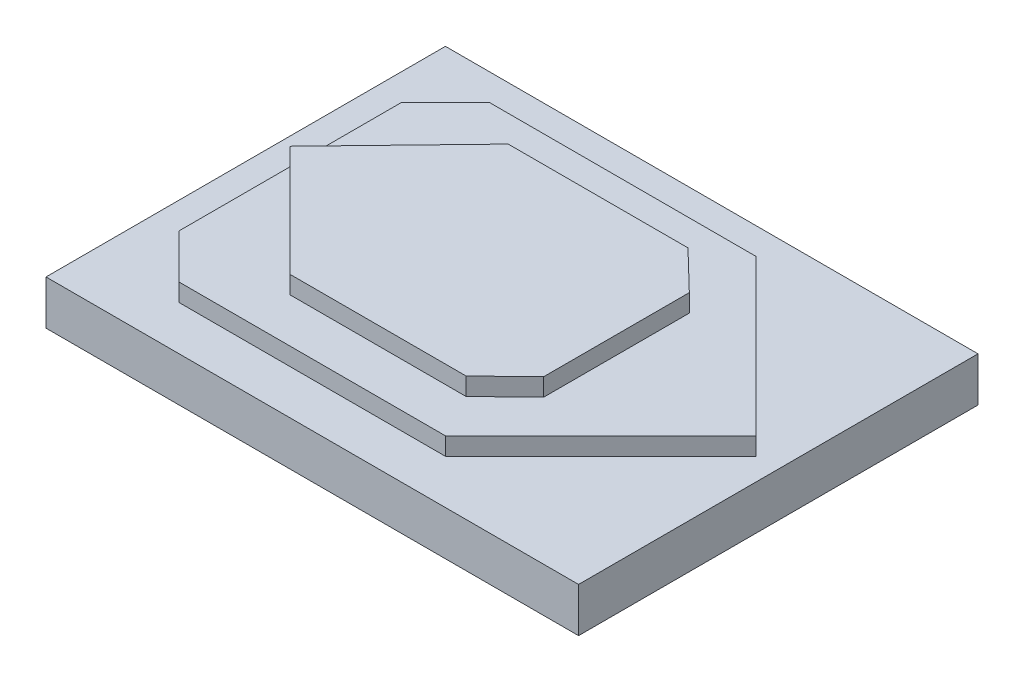
ISO-10303-21;
HEADER;
FILE_DESCRIPTION(('STEP AP214'),'2;1');
FILE_NAME('part.step','',(''),(''),'','','');
FILE_SCHEMA(('AUTOMOTIVE_DESIGN { 1 0 10303 214 1 1 1 1 }'));
ENDSEC;
DATA;
#1=APPLICATION_CONTEXT('core data for automotive mechanical design processes');
#2=APPLICATION_PROTOCOL_DEFINITION('international standard','automotive_design',2000,#1);
#3=PRODUCT_CONTEXT('',#1,'mechanical');
#4=PRODUCT('Part','Part','',(#3));
#5=PRODUCT_RELATED_PRODUCT_CATEGORY('part','',(#4));
#6=PRODUCT_DEFINITION_FORMATION('','',#4);
#7=PRODUCT_DEFINITION_CONTEXT('part definition',#1,'design');
#8=PRODUCT_DEFINITION('design','',#6,#7);
#9=PRODUCT_DEFINITION_SHAPE('','',#8);
#10=(LENGTH_UNIT() NAMED_UNIT(*) SI_UNIT(.MILLI.,.METRE.));
#11=(NAMED_UNIT(*) PLANE_ANGLE_UNIT() SI_UNIT($,.RADIAN.));
#12=(NAMED_UNIT(*) SI_UNIT($,.STERADIAN.) SOLID_ANGLE_UNIT());
#13=UNCERTAINTY_MEASURE_WITH_UNIT(LENGTH_MEASURE(1.E-05),#10,'distance_accuracy_value','');
#14=(GEOMETRIC_REPRESENTATION_CONTEXT(3) GLOBAL_UNCERTAINTY_ASSIGNED_CONTEXT((#13)) GLOBAL_UNIT_ASSIGNED_CONTEXT((#10,
#11,#12)) REPRESENTATION_CONTEXT('',''));
#15=CARTESIAN_POINT('',(0.,0.,0.));
#16=DIRECTION('',(0.,0.,1.));
#17=DIRECTION('',(1.,0.,0.));
#18=AXIS2_PLACEMENT_3D('',#15,#16,#17);
#19=CARTESIAN_POINT('',(0.,10.,0.));
#20=DIRECTION('',(0.,-1.,0.));
#21=DIRECTION('',(0.,0.,-1.));
#22=AXIS2_PLACEMENT_3D('',#19,#20,#21);
#23=PLANE('',#22);
#24=DIRECTION('',(0.,0.,1.));
#25=VECTOR('',#24,1.);
#26=CARTESIAN_POINT('',(0.,10.,0.));
#27=LINE('',#26,#25);
#28=CARTESIAN_POINT('',(0.,10.,-90.));
#29=VERTEX_POINT('',#28);
#30=CARTESIAN_POINT('',(0.,10.,0.));
#31=VERTEX_POINT('',#30);
#32=EDGE_CURVE('E253',#29,#31,#27,.T.);
#33=ORIENTED_EDGE('',*,*,#32,.T.);
#34=DIRECTION('',(1.,0.,0.));
#35=VECTOR('',#34,1.);
#36=CARTESIAN_POINT('',(0.,10.,0.));
#37=LINE('',#36,#35);
#38=CARTESIAN_POINT('',(120.,10.,0.));
#39=VERTEX_POINT('',#38);
#40=EDGE_CURVE('E256',#31,#39,#37,.T.);
#41=ORIENTED_EDGE('',*,*,#40,.T.);
#42=DIRECTION('',(0.,0.,-1.));
#43=VECTOR('',#42,1.);
#44=CARTESIAN_POINT('',(120.,10.,0.));
#45=LINE('',#44,#43);
#46=CARTESIAN_POINT('',(120.,10.,-90.));
#47=VERTEX_POINT('',#46);
#48=EDGE_CURVE('E259',#39,#47,#45,.T.);
#49=ORIENTED_EDGE('',*,*,#48,.T.);
#50=DIRECTION('',(-1.,0.,0.));
#51=VECTOR('',#50,1.);
#52=CARTESIAN_POINT('',(0.,10.,-90.));
#53=LINE('',#52,#51);
#54=EDGE_CURVE('E261',#47,#29,#53,.T.);
#55=ORIENTED_EDGE('',*,*,#54,.T.);
#56=EDGE_LOOP('',(#33,#41,#49,#55));
#57=FACE_BOUND('',#56,.T.);
#58=DIRECTION('',(0.,0.,1.));
#59=VECTOR('',#58,1.);
#60=CARTESIAN_POINT('',(9.99999999999997,10.,-20.));
#61=LINE('',#60,#59);
#62=CARTESIAN_POINT('',(9.99999999999997,10.,-69.9999999999992));
#63=VERTEX_POINT('',#62);
#64=CARTESIAN_POINT('',(9.99999999999997,10.,-20.));
#65=VERTEX_POINT('',#64);
#66=EDGE_CURVE('E61',#63,#65,#61,.T.);
#67=ORIENTED_EDGE('',*,*,#66,.F.);
#68=DIRECTION('',(-0.707106781186519,0.,0.707106781186576));
#69=VECTOR('',#68,1.);
#70=CARTESIAN_POINT('',(9.99999999999997,10.,-69.9999999999992));
#71=LINE('',#70,#69);
#72=CARTESIAN_POINT('',(20.,10.,-80.));
#73=VERTEX_POINT('',#72);
#74=EDGE_CURVE('E199',#73,#63,#71,.T.);
#75=ORIENTED_EDGE('',*,*,#74,.F.);
#76=DIRECTION('',(-1.,0.,0.));
#77=VECTOR('',#76,1.);
#78=CARTESIAN_POINT('',(20.,10.,-80.));
#79=LINE('',#78,#77);
#80=CARTESIAN_POINT('',(79.9999999999996,10.,-80.));
#81=VERTEX_POINT('',#80);
#82=EDGE_CURVE('E231',#81,#73,#79,.T.);
#83=ORIENTED_EDGE('',*,*,#82,.F.);
#84=DIRECTION('',(-0.707106781186552,0.,-0.707106781186543));
#85=VECTOR('',#84,1.);
#86=CARTESIAN_POINT('',(79.9999999999996,10.,-80.));
#87=LINE('',#86,#85);
#88=CARTESIAN_POINT('',(115.,10.,-45.));
#89=VERTEX_POINT('',#88);
#90=EDGE_CURVE('E228',#89,#81,#87,.T.);
#91=ORIENTED_EDGE('',*,*,#90,.F.);
#92=DIRECTION('',(0.707106781186543,0.,-0.707106781186552));
#93=VECTOR('',#92,1.);
#94=CARTESIAN_POINT('',(115.,10.,-45.));
#95=LINE('',#94,#93);
#96=CARTESIAN_POINT('',(80.,10.,-9.99999999999957));
#97=VERTEX_POINT('',#96);
#98=EDGE_CURVE('E225',#97,#89,#95,.T.);
#99=ORIENTED_EDGE('',*,*,#98,.F.);
#100=DIRECTION('',(1.,0.,0.));
#101=VECTOR('',#100,1.);
#102=CARTESIAN_POINT('',(80.,10.,-9.99999999999957));
#103=LINE('',#102,#101);
#104=CARTESIAN_POINT('',(20.0000000000008,10.,-10.));
#105=VERTEX_POINT('',#104);
#106=EDGE_CURVE('E222',#105,#97,#103,.T.);
#107=ORIENTED_EDGE('',*,*,#106,.F.);
#108=DIRECTION('',(0.707106781186576,0.,0.707106781186519));
#109=VECTOR('',#108,1.);
#110=CARTESIAN_POINT('',(20.0000000000008,10.,-10.));
#111=LINE('',#110,#109);
#112=EDGE_CURVE('E219',#65,#105,#111,.T.);
#113=ORIENTED_EDGE('',*,*,#112,.F.);
#114=EDGE_LOOP('',(#67,#75,#83,#91,#99,#107,#113));
#115=FACE_BOUND('',#114,.T.);
#116=ADVANCED_FACE('F38',(#57,#115),#23,.F.);
#117=CARTESIAN_POINT('',(0.,10.,0.));
#118=DIRECTION('',(1.,0.,0.));
#119=DIRECTION('',(0.,0.,-1.));
#120=AXIS2_PLACEMENT_3D('',#117,#118,#119);
#121=PLANE('',#120);
#122=DIRECTION('',(0.,0.,1.));
#123=VECTOR('',#122,1.);
#124=CARTESIAN_POINT('',(0.,0.,0.));
#125=LINE('',#124,#123);
#126=CARTESIAN_POINT('',(0.,0.,-90.));
#127=VERTEX_POINT('',#126);
#128=CARTESIAN_POINT('',(0.,0.,0.));
#129=VERTEX_POINT('',#128);
#130=EDGE_CURVE('E252',#127,#129,#125,.T.);
#131=ORIENTED_EDGE('',*,*,#130,.T.);
#132=DIRECTION('',(0.,-1.,0.));
#133=VECTOR('',#132,1.);
#134=CARTESIAN_POINT('',(0.,10.,0.));
#135=LINE('',#134,#133);
#136=EDGE_CURVE('E11',#31,#129,#135,.T.);
#137=ORIENTED_EDGE('',*,*,#136,.F.);
#138=ORIENTED_EDGE('',*,*,#32,.F.);
#139=DIRECTION('',(0.,-1.,0.));
#140=VECTOR('',#139,1.);
#141=CARTESIAN_POINT('',(0.,10.,-90.));
#142=LINE('',#141,#140);
#143=EDGE_CURVE('E263',#29,#127,#142,.T.);
#144=ORIENTED_EDGE('',*,*,#143,.T.);
#145=EDGE_LOOP('',(#131,#137,#138,#144));
#146=FACE_BOUND('',#145,.T.);
#147=ADVANCED_FACE('F40',(#146),#121,.F.);
#148=CARTESIAN_POINT('',(0.,10.,0.));
#149=DIRECTION('',(0.,0.,-1.));
#150=DIRECTION('',(-1.,0.,0.));
#151=AXIS2_PLACEMENT_3D('',#148,#149,#150);
#152=PLANE('',#151);
#153=DIRECTION('',(1.,0.,0.));
#154=VECTOR('',#153,1.);
#155=CARTESIAN_POINT('',(0.,0.,0.));
#156=LINE('',#155,#154);
#157=CARTESIAN_POINT('',(120.,0.,0.));
#158=VERTEX_POINT('',#157);
#159=EDGE_CURVE('E266',#129,#158,#156,.T.);
#160=ORIENTED_EDGE('',*,*,#159,.T.);
#161=DIRECTION('',(0.,-1.,0.));
#162=VECTOR('',#161,1.);
#163=CARTESIAN_POINT('',(120.,10.,0.));
#164=LINE('',#163,#162);
#165=EDGE_CURVE('E46',#39,#158,#164,.T.);
#166=ORIENTED_EDGE('',*,*,#165,.F.);
#167=ORIENTED_EDGE('',*,*,#40,.F.);
#168=ORIENTED_EDGE('',*,*,#136,.T.);
#169=EDGE_LOOP('',(#160,#166,#167,#168));
#170=FACE_BOUND('',#169,.T.);
#171=ADVANCED_FACE('F295',(#170),#152,.F.);
#172=CARTESIAN_POINT('',(120.,10.,0.));
#173=DIRECTION('',(-1.,0.,0.));
#174=DIRECTION('',(0.,0.,1.));
#175=AXIS2_PLACEMENT_3D('',#172,#173,#174);
#176=PLANE('',#175);
#177=DIRECTION('',(0.,0.,-1.));
#178=VECTOR('',#177,1.);
#179=CARTESIAN_POINT('',(120.,0.,0.));
#180=LINE('',#179,#178);
#181=CARTESIAN_POINT('',(120.,0.,-90.));
#182=VERTEX_POINT('',#181);
#183=EDGE_CURVE('E268',#158,#182,#180,.T.);
#184=ORIENTED_EDGE('',*,*,#183,.T.);
#185=DIRECTION('',(0.,-1.,0.));
#186=VECTOR('',#185,1.);
#187=CARTESIAN_POINT('',(120.,10.,-90.));
#188=LINE('',#187,#186);
#189=EDGE_CURVE('E273',#47,#182,#188,.T.);
#190=ORIENTED_EDGE('',*,*,#189,.F.);
#191=ORIENTED_EDGE('',*,*,#48,.F.);
#192=ORIENTED_EDGE('',*,*,#165,.T.);
#193=EDGE_LOOP('',(#184,#190,#191,#192));
#194=FACE_BOUND('',#193,.T.);
#195=ADVANCED_FACE('F280',(#194),#176,.F.);
#196=CARTESIAN_POINT('',(0.,10.,-90.));
#197=DIRECTION('',(0.,0.,1.));
#198=DIRECTION('',(1.,0.,0.));
#199=AXIS2_PLACEMENT_3D('',#196,#197,#198);
#200=PLANE('',#199);
#201=DIRECTION('',(-1.,0.,0.));
#202=VECTOR('',#201,1.);
#203=CARTESIAN_POINT('',(0.,0.,-90.));
#204=LINE('',#203,#202);
#205=EDGE_CURVE('E257',#182,#127,#204,.T.);
#206=ORIENTED_EDGE('',*,*,#205,.T.);
#207=ORIENTED_EDGE('',*,*,#143,.F.);
#208=ORIENTED_EDGE('',*,*,#54,.F.);
#209=ORIENTED_EDGE('',*,*,#189,.T.);
#210=EDGE_LOOP('',(#206,#207,#208,#209));
#211=FACE_BOUND('',#210,.T.);
#212=ADVANCED_FACE('F289',(#211),#200,.F.);
#213=CARTESIAN_POINT('',(0.,0.,0.));
#214=DIRECTION('',(0.,-1.,0.));
#215=DIRECTION('',(0.,0.,-1.));
#216=AXIS2_PLACEMENT_3D('',#213,#214,#215);
#217=PLANE('',#216);
#218=ORIENTED_EDGE('',*,*,#130,.F.);
#219=ORIENTED_EDGE('',*,*,#205,.F.);
#220=ORIENTED_EDGE('',*,*,#183,.F.);
#221=ORIENTED_EDGE('',*,*,#159,.F.);
#222=EDGE_LOOP('',(#218,#219,#220,#221));
#223=FACE_BOUND('',#222,.T.);
#224=ADVANCED_FACE('F286',(#223),#217,.T.);
#225=CARTESIAN_POINT('',(9.99999999999997,14.,-20.));
#226=DIRECTION('',(1.,0.,0.));
#227=DIRECTION('',(0.,0.,-1.));
#228=AXIS2_PLACEMENT_3D('',#225,#226,#227);
#229=PLANE('',#228);
#230=ORIENTED_EDGE('',*,*,#66,.T.);
#231=DIRECTION('',(0.,-1.,0.));
#232=VECTOR('',#231,1.);
#233=CARTESIAN_POINT('',(9.99999999999997,14.,-20.));
#234=LINE('',#233,#232);
#235=CARTESIAN_POINT('',(9.99999999999997,14.,-20.));
#236=VERTEX_POINT('',#235);
#237=EDGE_CURVE('E198',#236,#65,#234,.T.);
#238=ORIENTED_EDGE('',*,*,#237,.F.);
#239=DIRECTION('',(0.,0.,1.));
#240=VECTOR('',#239,1.);
#241=CARTESIAN_POINT('',(9.99999999999997,14.,-20.));
#242=LINE('',#241,#240);
#243=CARTESIAN_POINT('',(9.99999999999997,14.,-44.9999999999996));
#244=VERTEX_POINT('',#243);
#245=EDGE_CURVE('E184',#244,#236,#242,.T.);
#246=ORIENTED_EDGE('',*,*,#245,.F.);
#247=CARTESIAN_POINT('',(9.99999999999997,14.,-69.9999999999992));
#248=VERTEX_POINT('',#247);
#249=EDGE_CURVE('E196',#248,#244,#242,.T.);
#250=ORIENTED_EDGE('',*,*,#249,.F.);
#251=DIRECTION('',(0.,-1.,0.));
#252=VECTOR('',#251,1.);
#253=CARTESIAN_POINT('',(9.99999999999997,14.,-69.9999999999992));
#254=LINE('',#253,#252);
#255=EDGE_CURVE('E217',#248,#63,#254,.T.);
#256=ORIENTED_EDGE('',*,*,#255,.T.);
#257=EDGE_LOOP('',(#230,#238,#246,#250,#256));
#258=FACE_BOUND('',#257,.T.);
#259=ADVANCED_FACE('F194',(#258),#229,.F.);
#260=CARTESIAN_POINT('',(20.0000000000008,14.,-10.));
#261=DIRECTION('',(0.707106781186519,0.,-0.707106781186576));
#262=DIRECTION('',(-0.707106781186576,0.,-0.707106781186519));
#263=AXIS2_PLACEMENT_3D('',#260,#261,#262);
#264=PLANE('',#263);
#265=ORIENTED_EDGE('',*,*,#112,.T.);
#266=DIRECTION('',(0.,-1.,0.));
#267=VECTOR('',#266,1.);
#268=CARTESIAN_POINT('',(20.0000000000008,14.,-10.));
#269=LINE('',#268,#267);
#270=CARTESIAN_POINT('',(20.0000000000008,14.,-10.));
#271=VERTEX_POINT('',#270);
#272=EDGE_CURVE('E248',#271,#105,#269,.T.);
#273=ORIENTED_EDGE('',*,*,#272,.F.);
#274=DIRECTION('',(0.707106781186576,0.,0.707106781186519));
#275=VECTOR('',#274,1.);
#276=CARTESIAN_POINT('',(20.0000000000008,14.,-10.));
#277=LINE('',#276,#275);
#278=EDGE_CURVE('E204',#236,#271,#277,.T.);
#279=ORIENTED_EDGE('',*,*,#278,.F.);
#280=ORIENTED_EDGE('',*,*,#237,.T.);
#281=EDGE_LOOP('',(#265,#273,#279,#280));
#282=FACE_BOUND('',#281,.T.);
#283=ADVANCED_FACE('F326',(#282),#264,.F.);
#284=CARTESIAN_POINT('',(80.,14.,-9.99999999999957));
#285=DIRECTION('',(0.,0.,-1.));
#286=DIRECTION('',(-1.,0.,0.));
#287=AXIS2_PLACEMENT_3D('',#284,#285,#286);
#288=PLANE('',#287);
#289=ORIENTED_EDGE('',*,*,#106,.T.);
#290=DIRECTION('',(0.,-1.,0.));
#291=VECTOR('',#290,1.);
#292=CARTESIAN_POINT('',(80.,14.,-9.99999999999957));
#293=LINE('',#292,#291);
#294=CARTESIAN_POINT('',(80.,14.,-9.99999999999957));
#295=VERTEX_POINT('',#294);
#296=EDGE_CURVE('E245',#295,#97,#293,.T.);
#297=ORIENTED_EDGE('',*,*,#296,.F.);
#298=DIRECTION('',(1.,0.,0.));
#299=VECTOR('',#298,1.);
#300=CARTESIAN_POINT('',(80.,14.,-9.99999999999957));
#301=LINE('',#300,#299);
#302=EDGE_CURVE('E205',#271,#295,#301,.T.);
#303=ORIENTED_EDGE('',*,*,#302,.F.);
#304=ORIENTED_EDGE('',*,*,#272,.T.);
#305=EDGE_LOOP('',(#289,#297,#303,#304));
#306=FACE_BOUND('',#305,.T.);
#307=ADVANCED_FACE('F334',(#306),#288,.F.);
#308=CARTESIAN_POINT('',(115.,14.,-45.));
#309=DIRECTION('',(-0.707106781186552,0.,-0.707106781186543));
#310=DIRECTION('',(-0.707106781186543,0.,0.707106781186552));
#311=AXIS2_PLACEMENT_3D('',#308,#309,#310);
#312=PLANE('',#311);
#313=ORIENTED_EDGE('',*,*,#98,.T.);
#314=DIRECTION('',(0.,-1.,0.));
#315=VECTOR('',#314,1.);
#316=CARTESIAN_POINT('',(115.,14.,-45.));
#317=LINE('',#316,#315);
#318=CARTESIAN_POINT('',(115.,14.,-45.));
#319=VERTEX_POINT('',#318);
#320=EDGE_CURVE('E242',#319,#89,#317,.T.);
#321=ORIENTED_EDGE('',*,*,#320,.F.);
#322=DIRECTION('',(0.707106781186543,0.,-0.707106781186552));
#323=VECTOR('',#322,1.);
#324=CARTESIAN_POINT('',(115.,14.,-45.));
#325=LINE('',#324,#323);
#326=EDGE_CURVE('E210',#295,#319,#325,.T.);
#327=ORIENTED_EDGE('',*,*,#326,.F.);
#328=ORIENTED_EDGE('',*,*,#296,.T.);
#329=EDGE_LOOP('',(#313,#321,#327,#328));
#330=FACE_BOUND('',#329,.T.);
#331=ADVANCED_FACE('F341',(#330),#312,.F.);
#332=CARTESIAN_POINT('',(79.9999999999996,14.,-80.));
#333=DIRECTION('',(-0.707106781186543,0.,0.707106781186552));
#334=DIRECTION('',(0.707106781186552,0.,0.707106781186543));
#335=AXIS2_PLACEMENT_3D('',#332,#333,#334);
#336=PLANE('',#335);
#337=ORIENTED_EDGE('',*,*,#90,.T.);
#338=DIRECTION('',(0.,-1.,0.));
#339=VECTOR('',#338,1.);
#340=CARTESIAN_POINT('',(79.9999999999996,14.,-80.));
#341=LINE('',#340,#339);
#342=CARTESIAN_POINT('',(79.9999999999996,14.,-80.));
#343=VERTEX_POINT('',#342);
#344=EDGE_CURVE('E239',#343,#81,#341,.T.);
#345=ORIENTED_EDGE('',*,*,#344,.F.);
#346=DIRECTION('',(-0.707106781186552,0.,-0.707106781186543));
#347=VECTOR('',#346,1.);
#348=CARTESIAN_POINT('',(79.9999999999996,14.,-80.));
#349=LINE('',#348,#347);
#350=EDGE_CURVE('E212',#319,#343,#349,.T.);
#351=ORIENTED_EDGE('',*,*,#350,.F.);
#352=ORIENTED_EDGE('',*,*,#320,.T.);
#353=EDGE_LOOP('',(#337,#345,#351,#352));
#354=FACE_BOUND('',#353,.T.);
#355=ADVANCED_FACE('F349',(#354),#336,.F.);
#356=CARTESIAN_POINT('',(20.,14.,-80.));
#357=DIRECTION('',(0.,0.,1.));
#358=DIRECTION('',(1.,0.,0.));
#359=AXIS2_PLACEMENT_3D('',#356,#357,#358);
#360=PLANE('',#359);
#361=ORIENTED_EDGE('',*,*,#82,.T.);
#362=DIRECTION('',(0.,-1.,0.));
#363=VECTOR('',#362,1.);
#364=CARTESIAN_POINT('',(20.,14.,-80.));
#365=LINE('',#364,#363);
#366=CARTESIAN_POINT('',(20.,14.,-80.));
#367=VERTEX_POINT('',#366);
#368=EDGE_CURVE('E236',#367,#73,#365,.T.);
#369=ORIENTED_EDGE('',*,*,#368,.F.);
#370=DIRECTION('',(-1.,0.,0.));
#371=VECTOR('',#370,1.);
#372=CARTESIAN_POINT('',(20.,14.,-80.));
#373=LINE('',#372,#371);
#374=EDGE_CURVE('E214',#343,#367,#373,.T.);
#375=ORIENTED_EDGE('',*,*,#374,.F.);
#376=ORIENTED_EDGE('',*,*,#344,.T.);
#377=EDGE_LOOP('',(#361,#369,#375,#376));
#378=FACE_BOUND('',#377,.T.);
#379=ADVANCED_FACE('F357',(#378),#360,.F.);
#380=CARTESIAN_POINT('',(9.99999999999997,14.,-69.9999999999992));
#381=DIRECTION('',(0.707106781186576,0.,0.707106781186519));
#382=DIRECTION('',(0.707106781186519,0.,-0.707106781186576));
#383=AXIS2_PLACEMENT_3D('',#380,#381,#382);
#384=PLANE('',#383);
#385=ORIENTED_EDGE('',*,*,#74,.T.);
#386=ORIENTED_EDGE('',*,*,#255,.F.);
#387=DIRECTION('',(-0.707106781186519,0.,0.707106781186576));
#388=VECTOR('',#387,1.);
#389=CARTESIAN_POINT('',(9.99999999999997,14.,-69.9999999999992));
#390=LINE('',#389,#388);
#391=EDGE_CURVE('E202',#367,#248,#390,.T.);
#392=ORIENTED_EDGE('',*,*,#391,.F.);
#393=ORIENTED_EDGE('',*,*,#368,.T.);
#394=EDGE_LOOP('',(#385,#386,#392,#393));
#395=FACE_BOUND('',#394,.T.);
#396=ADVANCED_FACE('F365',(#395),#384,.F.);
#397=CARTESIAN_POINT('',(0.,14.,0.));
#398=DIRECTION('',(0.,-1.,0.));
#399=DIRECTION('',(0.,0.,-1.));
#400=AXIS2_PLACEMENT_3D('',#397,#398,#399);
#401=PLANE('',#400);
#402=DIRECTION('',(-1.,0.,0.));
#403=VECTOR('',#402,1.);
#404=CARTESIAN_POINT('',(74.645,14.,-20.));
#405=LINE('',#404,#403);
#406=CARTESIAN_POINT('',(74.645,14.,-20.));
#407=VERTEX_POINT('',#406);
#408=CARTESIAN_POINT('',(35.,14.,-20.));
#409=VERTEX_POINT('',#408);
#410=EDGE_CURVE('E188',#407,#409,#405,.T.);
#411=ORIENTED_EDGE('',*,*,#410,.T.);
#412=DIRECTION('',(-0.707106781186553,0.,-0.707106781186542));
#413=VECTOR('',#412,1.);
#414=CARTESIAN_POINT('',(35.,14.,-20.));
#415=LINE('',#414,#413);
#416=EDGE_CURVE('E53',#409,#244,#415,.T.);
#417=ORIENTED_EDGE('',*,*,#416,.T.);
#418=ORIENTED_EDGE('',*,*,#245,.T.);
#419=ORIENTED_EDGE('',*,*,#278,.T.);
#420=ORIENTED_EDGE('',*,*,#302,.T.);
#421=ORIENTED_EDGE('',*,*,#326,.T.);
#422=ORIENTED_EDGE('',*,*,#350,.T.);
#423=ORIENTED_EDGE('',*,*,#374,.T.);
#424=ORIENTED_EDGE('',*,*,#391,.T.);
#425=ORIENTED_EDGE('',*,*,#249,.T.);
#426=DIRECTION('',(0.694658370458999,0.,-0.71933980033865));
#427=VECTOR('',#426,1.);
#428=CARTESIAN_POINT('',(9.99999999999997,14.,-44.9999999999996));
#429=LINE('',#428,#427);
#430=CARTESIAN_POINT('',(34.1422193701773,14.,-70.));
#431=VERTEX_POINT('',#430);
#432=EDGE_CURVE('E165',#244,#431,#429,.T.);
#433=ORIENTED_EDGE('',*,*,#432,.T.);
#434=DIRECTION('',(1.,0.,0.));
#435=VECTOR('',#434,1.);
#436=CARTESIAN_POINT('',(34.1422193701773,14.,-70.));
#437=LINE('',#436,#435);
#438=CARTESIAN_POINT('',(74.652034734988,14.,-70.));
#439=VERTEX_POINT('',#438);
#440=EDGE_CURVE('E175',#431,#439,#437,.T.);
#441=ORIENTED_EDGE('',*,*,#440,.T.);
#442=DIRECTION('',(0.719339800338649,0.,0.694658370459));
#443=VECTOR('',#442,1.);
#444=CARTESIAN_POINT('',(74.652034734988,14.,-70.));
#445=LINE('',#444,#443);
#446=CARTESIAN_POINT('',(83.5342439720035,14.,-61.4225502443264));
#447=VERTEX_POINT('',#446);
#448=EDGE_CURVE('E537',#439,#447,#445,.T.);
#449=ORIENTED_EDGE('',*,*,#448,.T.);
#450=DIRECTION('',(0.,0.,1.));
#451=VECTOR('',#450,1.);
#452=CARTESIAN_POINT('',(83.5342439720035,14.,-61.4225502443264));
#453=LINE('',#452,#451);
#454=CARTESIAN_POINT('',(83.5342439720035,14.,-28.5842431202854));
#455=VERTEX_POINT('',#454);
#456=EDGE_CURVE('E533',#447,#455,#453,.T.);
#457=ORIENTED_EDGE('',*,*,#456,.T.);
#458=DIRECTION('',(-0.719339800338647,0.,0.694658370459001));
#459=VECTOR('',#458,1.);
#460=CARTESIAN_POINT('',(83.5342439720035,14.,-28.5842431202854));
#461=LINE('',#460,#459);
#462=EDGE_CURVE('E536',#455,#407,#461,.T.);
#463=ORIENTED_EDGE('',*,*,#462,.T.);
#464=EDGE_LOOP('',(#411,#417,#418,#419,#420,#421,#422,#423,#424,#425,#433,#441,#449,#457,#463));
#465=FACE_BOUND('',#464,.T.);
#466=ADVANCED_FACE('F183',(#465),#401,.F.);
#467=CARTESIAN_POINT('',(35.,14.,-20.));
#468=DIRECTION('',(0.707106781186542,0.,-0.707106781186553));
#469=DIRECTION('',(-0.707106781186553,0.,-0.707106781186542));
#470=AXIS2_PLACEMENT_3D('',#467,#468,#469);
#471=PLANE('',#470);
#472=DIRECTION('',(-0.707106781186553,0.,-0.707106781186542));
#473=VECTOR('',#472,1.);
#474=CARTESIAN_POINT('',(35.,18.,-20.));
#475=LINE('',#474,#473);
#476=CARTESIAN_POINT('',(35.,18.,-20.));
#477=VERTEX_POINT('',#476);
#478=CARTESIAN_POINT('',(9.99999999999997,18.,-44.9999999999996));
#479=VERTEX_POINT('',#478);
#480=EDGE_CURVE('E179',#477,#479,#475,.T.);
#481=ORIENTED_EDGE('',*,*,#480,.T.);
#482=DIRECTION('',(0.,1.,0.));
#483=VECTOR('',#482,1.);
#484=CARTESIAN_POINT('',(9.99999999999997,14.,-44.9999999999996));
#485=LINE('',#484,#483);
#486=EDGE_CURVE('E167',#244,#479,#485,.T.);
#487=ORIENTED_EDGE('',*,*,#486,.F.);
#488=ORIENTED_EDGE('',*,*,#416,.F.);
#489=DIRECTION('',(0.,1.,0.));
#490=VECTOR('',#489,1.);
#491=CARTESIAN_POINT('',(35.,14.,-20.));
#492=LINE('',#491,#490);
#493=EDGE_CURVE('E516',#409,#477,#492,.T.);
#494=ORIENTED_EDGE('',*,*,#493,.T.);
#495=EDGE_LOOP('',(#481,#487,#488,#494));
#496=FACE_BOUND('',#495,.T.);
#497=ADVANCED_FACE('F177',(#496),#471,.F.);
#498=CARTESIAN_POINT('',(9.99999999999997,14.,-44.9999999999996));
#499=DIRECTION('',(0.71933980033865,0.,0.694658370458999));
#500=DIRECTION('',(0.694658370458999,0.,-0.71933980033865));
#501=AXIS2_PLACEMENT_3D('',#498,#499,#500);
#502=PLANE('',#501);
#503=DIRECTION('',(0.694658370458999,0.,-0.71933980033865));
#504=VECTOR('',#503,1.);
#505=CARTESIAN_POINT('',(9.99999999999997,18.,-44.9999999999996));
#506=LINE('',#505,#504);
#507=CARTESIAN_POINT('',(34.1422193701773,18.,-70.));
#508=VERTEX_POINT('',#507);
#509=EDGE_CURVE('E500',#479,#508,#506,.T.);
#510=ORIENTED_EDGE('',*,*,#509,.T.);
#511=DIRECTION('',(0.,1.,0.));
#512=VECTOR('',#511,1.);
#513=CARTESIAN_POINT('',(34.1422193701773,14.,-70.));
#514=LINE('',#513,#512);
#515=EDGE_CURVE('E170',#431,#508,#514,.T.);
#516=ORIENTED_EDGE('',*,*,#515,.F.);
#517=ORIENTED_EDGE('',*,*,#432,.F.);
#518=ORIENTED_EDGE('',*,*,#486,.T.);
#519=EDGE_LOOP('',(#510,#516,#517,#518));
#520=FACE_BOUND('',#519,.T.);
#521=ADVANCED_FACE('F166',(#520),#502,.F.);
#522=CARTESIAN_POINT('',(34.1422193701773,14.,-70.));
#523=DIRECTION('',(0.,0.,1.));
#524=DIRECTION('',(1.,0.,0.));
#525=AXIS2_PLACEMENT_3D('',#522,#523,#524);
#526=PLANE('',#525);
#527=DIRECTION('',(1.,0.,0.));
#528=VECTOR('',#527,1.);
#529=CARTESIAN_POINT('',(34.1422193701773,18.,-70.));
#530=LINE('',#529,#528);
#531=CARTESIAN_POINT('',(74.652034734988,18.,-70.));
#532=VERTEX_POINT('',#531);
#533=EDGE_CURVE('E502',#508,#532,#530,.T.);
#534=ORIENTED_EDGE('',*,*,#533,.T.);
#535=DIRECTION('',(0.,1.,0.));
#536=VECTOR('',#535,1.);
#537=CARTESIAN_POINT('',(74.652034734988,14.,-70.));
#538=LINE('',#537,#536);
#539=EDGE_CURVE('E527',#439,#532,#538,.T.);
#540=ORIENTED_EDGE('',*,*,#539,.F.);
#541=ORIENTED_EDGE('',*,*,#440,.F.);
#542=ORIENTED_EDGE('',*,*,#515,.T.);
#543=EDGE_LOOP('',(#534,#540,#541,#542));
#544=FACE_BOUND('',#543,.T.);
#545=ADVANCED_FACE('F390',(#544),#526,.F.);
#546=CARTESIAN_POINT('',(74.652034734988,14.,-70.));
#547=DIRECTION('',(-0.694658370459,0.,0.719339800338649));
#548=DIRECTION('',(0.719339800338649,0.,0.694658370459));
#549=AXIS2_PLACEMENT_3D('',#546,#547,#548);
#550=PLANE('',#549);
#551=DIRECTION('',(0.719339800338649,0.,0.694658370459));
#552=VECTOR('',#551,1.);
#553=CARTESIAN_POINT('',(74.652034734988,18.,-70.));
#554=LINE('',#553,#552);
#555=CARTESIAN_POINT('',(83.5342439720035,18.,-61.4225502443264));
#556=VERTEX_POINT('',#555);
#557=EDGE_CURVE('E508',#532,#556,#554,.T.);
#558=ORIENTED_EDGE('',*,*,#557,.T.);
#559=DIRECTION('',(0.,1.,0.));
#560=VECTOR('',#559,1.);
#561=CARTESIAN_POINT('',(83.5342439720035,14.,-61.4225502443264));
#562=LINE('',#561,#560);
#563=EDGE_CURVE('E524',#447,#556,#562,.T.);
#564=ORIENTED_EDGE('',*,*,#563,.F.);
#565=ORIENTED_EDGE('',*,*,#448,.F.);
#566=ORIENTED_EDGE('',*,*,#539,.T.);
#567=EDGE_LOOP('',(#558,#564,#565,#566));
#568=FACE_BOUND('',#567,.T.);
#569=ADVANCED_FACE('F397',(#568),#550,.F.);
#570=CARTESIAN_POINT('',(83.5342439720035,14.,-43.1692068732466));
#571=DIRECTION('',(-1.,0.,0.));
#572=DIRECTION('',(0.,0.,1.));
#573=AXIS2_PLACEMENT_3D('',#570,#571,#572);
#574=PLANE('',#573);
#575=DIRECTION('',(0.,0.,1.));
#576=VECTOR('',#575,1.);
#577=CARTESIAN_POINT('',(83.5342439720035,18.,-43.1692068732466));
#578=LINE('',#577,#576);
#579=CARTESIAN_POINT('',(83.5342439720035,18.,-28.5842431202854));
#580=VERTEX_POINT('',#579);
#581=EDGE_CURVE('E511',#556,#580,#578,.T.);
#582=ORIENTED_EDGE('',*,*,#581,.T.);
#583=DIRECTION('',(0.,1.,0.));
#584=VECTOR('',#583,1.);
#585=CARTESIAN_POINT('',(83.5342439720035,14.,-28.5842431202854));
#586=LINE('',#585,#584);
#587=EDGE_CURVE('E521',#455,#580,#586,.T.);
#588=ORIENTED_EDGE('',*,*,#587,.F.);
#589=ORIENTED_EDGE('',*,*,#456,.F.);
#590=ORIENTED_EDGE('',*,*,#563,.T.);
#591=EDGE_LOOP('',(#582,#588,#589,#590));
#592=FACE_BOUND('',#591,.T.);
#593=ADVANCED_FACE('F405',(#592),#574,.F.);
#594=CARTESIAN_POINT('',(83.5342439720035,14.,-28.5842431202854));
#595=DIRECTION('',(-0.694658370459001,0.,-0.719339800338647));
#596=DIRECTION('',(-0.719339800338647,0.,0.694658370459001));
#597=AXIS2_PLACEMENT_3D('',#594,#595,#596);
#598=PLANE('',#597);
#599=DIRECTION('',(-0.719339800338647,0.,0.694658370459001));
#600=VECTOR('',#599,1.);
#601=CARTESIAN_POINT('',(83.5342439720035,18.,-28.5842431202854));
#602=LINE('',#601,#600);
#603=CARTESIAN_POINT('',(74.645,18.,-20.));
#604=VERTEX_POINT('',#603);
#605=EDGE_CURVE('E513',#580,#604,#602,.T.);
#606=ORIENTED_EDGE('',*,*,#605,.T.);
#607=DIRECTION('',(0.,1.,0.));
#608=VECTOR('',#607,1.);
#609=CARTESIAN_POINT('',(74.645,14.,-20.));
#610=LINE('',#609,#608);
#611=EDGE_CURVE('E518',#407,#604,#610,.T.);
#612=ORIENTED_EDGE('',*,*,#611,.F.);
#613=ORIENTED_EDGE('',*,*,#462,.F.);
#614=ORIENTED_EDGE('',*,*,#587,.T.);
#615=EDGE_LOOP('',(#606,#612,#613,#614));
#616=FACE_BOUND('',#615,.T.);
#617=ADVANCED_FACE('F413',(#616),#598,.F.);
#618=CARTESIAN_POINT('',(74.645,14.,-20.));
#619=DIRECTION('',(0.,0.,-1.));
#620=DIRECTION('',(-1.,0.,0.));
#621=AXIS2_PLACEMENT_3D('',#618,#619,#620);
#622=PLANE('',#621);
#623=DIRECTION('',(-1.,0.,0.));
#624=VECTOR('',#623,1.);
#625=CARTESIAN_POINT('',(74.645,18.,-20.));
#626=LINE('',#625,#624);
#627=EDGE_CURVE('E189',#604,#477,#626,.T.);
#628=ORIENTED_EDGE('',*,*,#627,.T.);
#629=ORIENTED_EDGE('',*,*,#493,.F.);
#630=ORIENTED_EDGE('',*,*,#410,.F.);
#631=ORIENTED_EDGE('',*,*,#611,.T.);
#632=EDGE_LOOP('',(#628,#629,#630,#631));
#633=FACE_BOUND('',#632,.T.);
#634=ADVANCED_FACE('F421',(#633),#622,.F.);
#635=CARTESIAN_POINT('',(0.,18.,0.));
#636=DIRECTION('',(0.,-1.,0.));
#637=DIRECTION('',(0.,0.,-1.));
#638=AXIS2_PLACEMENT_3D('',#635,#636,#637);
#639=PLANE('',#638);
#640=ORIENTED_EDGE('',*,*,#480,.F.);
#641=ORIENTED_EDGE('',*,*,#627,.F.);
#642=ORIENTED_EDGE('',*,*,#605,.F.);
#643=ORIENTED_EDGE('',*,*,#581,.F.);
#644=ORIENTED_EDGE('',*,*,#557,.F.);
#645=ORIENTED_EDGE('',*,*,#533,.F.);
#646=ORIENTED_EDGE('',*,*,#509,.F.);
#647=EDGE_LOOP('',(#640,#641,#642,#643,#644,#645,#646));
#648=FACE_BOUND('',#647,.T.);
#649=ADVANCED_FACE('F429',(#648),#639,.F.);
#650=CLOSED_SHELL('',(#116,#147,#171,#195,#212,#224,#259,#283,#307,#331,#355,#379,#396,#466,
#497,#521,#545,#569,#593,#617,#634,#649));
#651=MANIFOLD_SOLID_BREP('B2',#650);
#652=ADVANCED_BREP_SHAPE_REPRESENTATION('',(#18,#651),#14);
#653=SHAPE_DEFINITION_REPRESENTATION(#9,#652);
ENDSEC;
END-ISO-10303-21;
